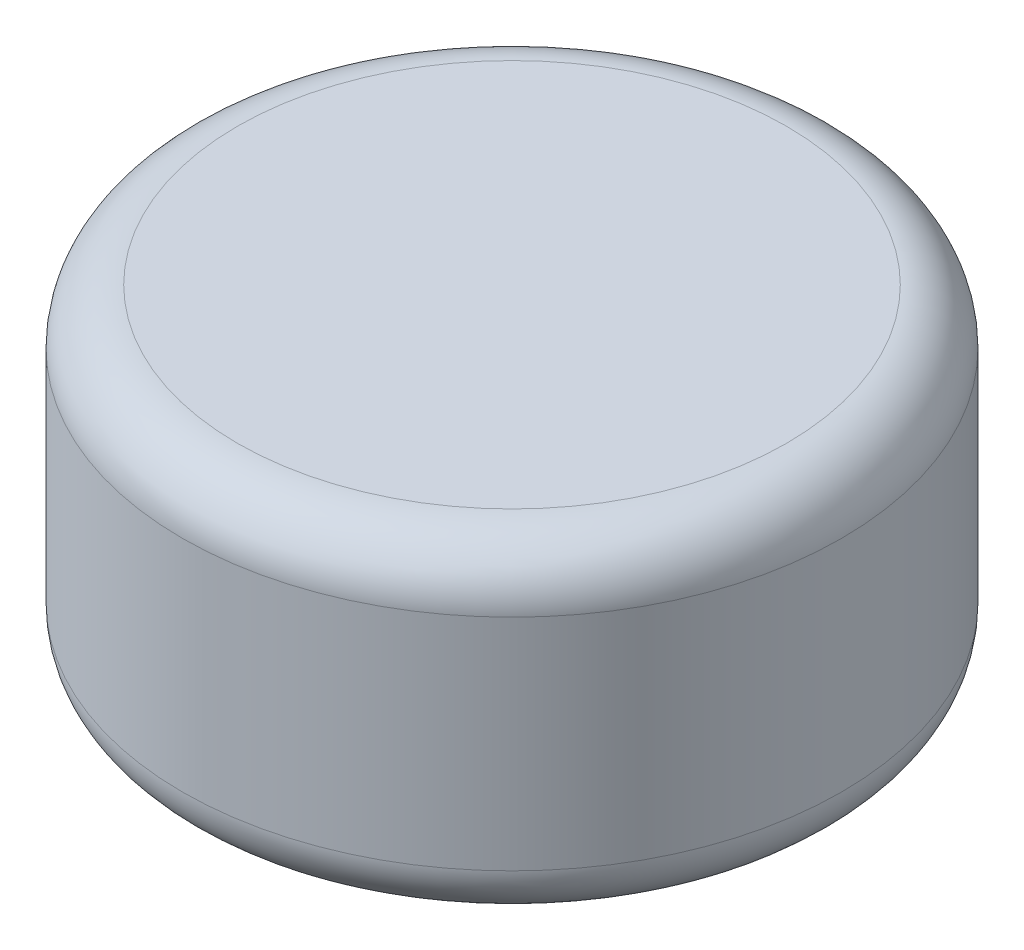
ISO-10303-21;
HEADER;
FILE_DESCRIPTION(('STEP AP214'),'2;1');
FILE_NAME('part.step','',(''),(''),'','','');
FILE_SCHEMA(('AUTOMOTIVE_DESIGN { 1 0 10303 214 1 1 1 1 }'));
ENDSEC;
DATA;
#1=APPLICATION_CONTEXT('core data for automotive mechanical design processes');
#2=APPLICATION_PROTOCOL_DEFINITION('international standard','automotive_design',2000,#1);
#3=PRODUCT_CONTEXT('',#1,'mechanical');
#4=PRODUCT('Part','Part','',(#3));
#5=PRODUCT_RELATED_PRODUCT_CATEGORY('part','',(#4));
#6=PRODUCT_DEFINITION_FORMATION('','',#4);
#7=PRODUCT_DEFINITION_CONTEXT('part definition',#1,'design');
#8=PRODUCT_DEFINITION('design','',#6,#7);
#9=PRODUCT_DEFINITION_SHAPE('','',#8);
#10=(LENGTH_UNIT() NAMED_UNIT(*) SI_UNIT(.MILLI.,.METRE.));
#11=(NAMED_UNIT(*) PLANE_ANGLE_UNIT() SI_UNIT($,.RADIAN.));
#12=(NAMED_UNIT(*) SI_UNIT($,.STERADIAN.) SOLID_ANGLE_UNIT());
#13=UNCERTAINTY_MEASURE_WITH_UNIT(LENGTH_MEASURE(1.E-05),#10,'distance_accuracy_value','');
#14=(GEOMETRIC_REPRESENTATION_CONTEXT(3) GLOBAL_UNCERTAINTY_ASSIGNED_CONTEXT((#13)) GLOBAL_UNIT_ASSIGNED_CONTEXT((#10,
#11,#12)) REPRESENTATION_CONTEXT('',''));
#15=CARTESIAN_POINT('',(0.,0.,0.));
#16=DIRECTION('',(0.,0.,1.));
#17=DIRECTION('',(1.,0.,0.));
#18=AXIS2_PLACEMENT_3D('',#15,#16,#17);
#19=CARTESIAN_POINT('',(0.,3.,0.));
#20=DIRECTION('',(0.,-1.,0.));
#21=DIRECTION('',(0.,0.,-1.));
#22=AXIS2_PLACEMENT_3D('',#19,#20,#21);
#23=CYLINDRICAL_SURFACE('',#22,3.);
#24=CARTESIAN_POINT('',(0.,0.5,0.));
#25=DIRECTION('',(0.,1.,0.));
#26=DIRECTION('',(0.,0.,1.));
#27=AXIS2_PLACEMENT_3D('',#24,#25,#26);
#28=CIRCLE('',#27,3.);
#29=CARTESIAN_POINT('',(0.,0.5,3.));
#30=VERTEX_POINT('',#29);
#31=EDGE_CURVE('E51',#30,#30,#28,.T.);
#32=ORIENTED_EDGE('',*,*,#31,.T.);
#33=EDGE_LOOP('',(#32));
#34=FACE_BOUND('',#33,.T.);
#35=CARTESIAN_POINT('',(0.,2.5,0.));
#36=DIRECTION('',(0.,1.,0.));
#37=DIRECTION('',(0.,0.,1.));
#38=AXIS2_PLACEMENT_3D('',#35,#36,#37);
#39=CIRCLE('',#38,3.);
#40=CARTESIAN_POINT('',(0.,2.5,3.));
#41=VERTEX_POINT('',#40);
#42=EDGE_CURVE('E56',#41,#41,#39,.F.);
#43=ORIENTED_EDGE('',*,*,#42,.T.);
#44=EDGE_LOOP('',(#43));
#45=FACE_BOUND('',#44,.T.);
#46=ADVANCED_FACE('F43',(#34,#45),#23,.T.);
#47=CARTESIAN_POINT('',(0.,3.,0.));
#48=DIRECTION('',(0.,1.,0.));
#49=DIRECTION('',(0.,0.,1.));
#50=AXIS2_PLACEMENT_3D('',#47,#48,#49);
#51=PLANE('',#50);
#52=CARTESIAN_POINT('',(0.,3.,0.));
#53=DIRECTION('',(0.,1.,0.));
#54=DIRECTION('',(0.,0.,1.));
#55=AXIS2_PLACEMENT_3D('',#52,#53,#54);
#56=CIRCLE('',#55,2.5);
#57=CARTESIAN_POINT('',(0.,3.,2.5));
#58=VERTEX_POINT('',#57);
#59=EDGE_CURVE('E61',#58,#58,#56,.T.);
#60=ORIENTED_EDGE('',*,*,#59,.T.);
#61=EDGE_LOOP('',(#60));
#62=FACE_BOUND('',#61,.T.);
#63=ADVANCED_FACE('F68',(#62),#51,.T.);
#64=CARTESIAN_POINT('',(0.,0.,0.));
#65=DIRECTION('',(0.,1.,0.));
#66=DIRECTION('',(0.,0.,1.));
#67=AXIS2_PLACEMENT_3D('',#64,#65,#66);
#68=PLANE('',#67);
#69=CARTESIAN_POINT('',(0.,0.,0.));
#70=DIRECTION('',(0.,1.,0.));
#71=DIRECTION('',(0.,0.,1.));
#72=AXIS2_PLACEMENT_3D('',#69,#70,#71);
#73=CIRCLE('',#72,2.5);
#74=CARTESIAN_POINT('',(0.,0.,2.5));
#75=VERTEX_POINT('',#74);
#76=EDGE_CURVE('E10',#75,#75,#73,.F.);
#77=ORIENTED_EDGE('',*,*,#76,.T.);
#78=EDGE_LOOP('',(#77));
#79=FACE_BOUND('',#78,.T.);
#80=ADVANCED_FACE('F72',(#79),#68,.F.);
#81=CARTESIAN_POINT('',(0.,2.5,0.));
#82=DIRECTION('',(0.,1.,0.));
#83=DIRECTION('',(0.,0.,1.));
#84=AXIS2_PLACEMENT_3D('',#81,#82,#83);
#85=TOROIDAL_SURFACE('',#84,2.5,0.5);
#86=ORIENTED_EDGE('',*,*,#42,.F.);
#87=EDGE_LOOP('',(#86));
#88=FACE_BOUND('',#87,.T.);
#89=ORIENTED_EDGE('',*,*,#59,.F.);
#90=EDGE_LOOP('',(#89));
#91=FACE_BOUND('',#90,.T.);
#92=ADVANCED_FACE('F70',(#88,#91),#85,.T.);
#93=CARTESIAN_POINT('',(0.,0.5,0.));
#94=DIRECTION('',(0.,1.,0.));
#95=DIRECTION('',(0.,0.,1.));
#96=AXIS2_PLACEMENT_3D('',#93,#94,#95);
#97=TOROIDAL_SURFACE('',#96,2.5,0.5);
#98=ORIENTED_EDGE('',*,*,#76,.F.);
#99=EDGE_LOOP('',(#98));
#100=FACE_BOUND('',#99,.T.);
#101=ORIENTED_EDGE('',*,*,#31,.F.);
#102=EDGE_LOOP('',(#101));
#103=FACE_BOUND('',#102,.T.);
#104=ADVANCED_FACE('F45',(#100,#103),#97,.T.);
#105=CLOSED_SHELL('',(#46,#63,#80,#92,#104));
#106=MANIFOLD_SOLID_BREP('B2',#105);
#107=ADVANCED_BREP_SHAPE_REPRESENTATION('',(#18,#106),#14);
#108=SHAPE_DEFINITION_REPRESENTATION(#9,#107);
ENDSEC;
END-ISO-10303-21;
